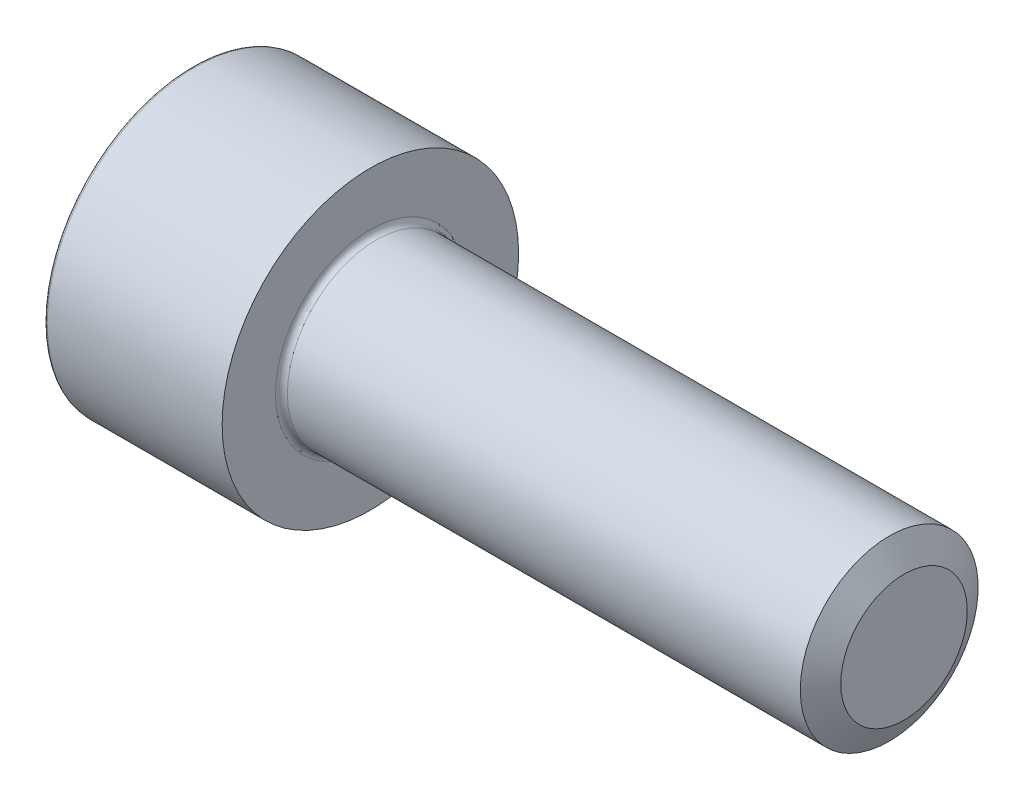
ISO-10303-21;
HEADER;
FILE_DESCRIPTION(('STEP AP214'),'2;1');
FILE_NAME('part.step','',(''),(''),'','','');
FILE_SCHEMA(('AUTOMOTIVE_DESIGN { 1 0 10303 214 1 1 1 1 }'));
ENDSEC;
DATA;
#1=APPLICATION_CONTEXT('core data for automotive mechanical design processes');
#2=APPLICATION_PROTOCOL_DEFINITION('international standard','automotive_design',2000,#1);
#3=PRODUCT_CONTEXT('',#1,'mechanical');
#4=PRODUCT('Part','Part','',(#3));
#5=PRODUCT_RELATED_PRODUCT_CATEGORY('part','',(#4));
#6=PRODUCT_DEFINITION_FORMATION('','',#4);
#7=PRODUCT_DEFINITION_CONTEXT('part definition',#1,'design');
#8=PRODUCT_DEFINITION('design','',#6,#7);
#9=PRODUCT_DEFINITION_SHAPE('','',#8);
#10=(LENGTH_UNIT() NAMED_UNIT(*) SI_UNIT(.MILLI.,.METRE.));
#11=(NAMED_UNIT(*) PLANE_ANGLE_UNIT() SI_UNIT($,.RADIAN.));
#12=(NAMED_UNIT(*) SI_UNIT($,.STERADIAN.) SOLID_ANGLE_UNIT());
#13=UNCERTAINTY_MEASURE_WITH_UNIT(LENGTH_MEASURE(1.E-05),#10,'distance_accuracy_value','');
#14=(GEOMETRIC_REPRESENTATION_CONTEXT(3) GLOBAL_UNCERTAINTY_ASSIGNED_CONTEXT((#13)) GLOBAL_UNIT_ASSIGNED_CONTEXT((#10,
#11,#12)) REPRESENTATION_CONTEXT('',''));
#15=CARTESIAN_POINT('',(0.,0.,0.));
#16=DIRECTION('',(0.,0.,1.));
#17=DIRECTION('',(1.,0.,0.));
#18=AXIS2_PLACEMENT_3D('',#15,#16,#17);
#19=CARTESIAN_POINT('',(0.,0.,0.));
#20=DIRECTION('',(-1.,0.,0.));
#21=DIRECTION('',(0.,0.,1.));
#22=AXIS2_PLACEMENT_3D('',#19,#20,#21);
#23=CYLINDRICAL_SURFACE('',#22,3.);
#24=CARTESIAN_POINT('',(6.2,0.,0.));
#25=DIRECTION('',(-1.,0.,0.));
#26=DIRECTION('',(0.,0.,1.));
#27=AXIS2_PLACEMENT_3D('',#24,#25,#26);
#28=CIRCLE('',#27,3.);
#29=CARTESIAN_POINT('',(6.2,0.,3.));
#30=VERTEX_POINT('',#29);
#31=EDGE_CURVE('E148',#30,#30,#28,.T.);
#32=ORIENTED_EDGE('',*,*,#31,.F.);
#33=EDGE_LOOP('',(#32));
#34=FACE_BOUND('',#33,.T.);
#35=CARTESIAN_POINT('',(23.5000146668818,0.,0.));
#36=DIRECTION('',(-1.,0.,0.));
#37=DIRECTION('',(0.,0.,1.));
#38=AXIS2_PLACEMENT_3D('',#35,#36,#37);
#39=CIRCLE('',#38,3.);
#40=CARTESIAN_POINT('',(23.5000146668818,0.,3.));
#41=VERTEX_POINT('',#40);
#42=EDGE_CURVE('E135',#41,#41,#39,.T.);
#43=ORIENTED_EDGE('',*,*,#42,.T.);
#44=EDGE_LOOP('',(#43));
#45=FACE_BOUND('',#44,.T.);
#46=ADVANCED_FACE('F45',(#34,#45),#23,.T.);
#47=CARTESIAN_POINT('',(0.,0.,0.));
#48=DIRECTION('',(1.,0.,0.));
#49=DIRECTION('',(0.,0.,-1.));
#50=AXIS2_PLACEMENT_3D('',#47,#48,#49);
#51=PLANE('',#50);
#52=CARTESIAN_POINT('',(0.,0.,0.));
#53=DIRECTION('',(1.,0.,0.));
#54=DIRECTION('',(0.,0.,-1.));
#55=AXIS2_PLACEMENT_3D('',#52,#53,#54);
#56=CIRCLE('',#55,4.9);
#57=CARTESIAN_POINT('',(0.,0.,-4.9));
#58=VERTEX_POINT('',#57);
#59=EDGE_CURVE('E53',#58,#58,#56,.F.);
#60=ORIENTED_EDGE('',*,*,#59,.T.);
#61=EDGE_LOOP('',(#60));
#62=FACE_BOUND('',#61,.T.);
#63=DIRECTION('',(0.,0.866025403784439,-0.5));
#64=VECTOR('',#63,1.);
#65=CARTESIAN_POINT('',(0.,0.,2.86));
#66=LINE('',#65,#64);
#67=CARTESIAN_POINT('',(0.,0.,2.86));
#68=VERTEX_POINT('',#67);
#69=CARTESIAN_POINT('',(0.,2.47683265482349,1.43));
#70=VERTEX_POINT('',#69);
#71=EDGE_CURVE('E134',#68,#70,#66,.T.);
#72=ORIENTED_EDGE('',*,*,#71,.F.);
#73=DIRECTION('',(0.,0.866025403784439,0.5));
#74=VECTOR('',#73,1.);
#75=CARTESIAN_POINT('',(0.,-2.47683265482349,1.43));
#76=LINE('',#75,#74);
#77=CARTESIAN_POINT('',(0.,-2.47683265482349,1.43));
#78=VERTEX_POINT('',#77);
#79=EDGE_CURVE('E60',#78,#68,#76,.T.);
#80=ORIENTED_EDGE('',*,*,#79,.F.);
#81=DIRECTION('',(0.,0.,1.));
#82=VECTOR('',#81,1.);
#83=CARTESIAN_POINT('',(0.,-2.47683265482349,-1.43));
#84=LINE('',#83,#82);
#85=CARTESIAN_POINT('',(0.,-2.47683265482349,-1.43));
#86=VERTEX_POINT('',#85);
#87=EDGE_CURVE('E144',#86,#78,#84,.T.);
#88=ORIENTED_EDGE('',*,*,#87,.F.);
#89=DIRECTION('',(0.,-0.866025403784439,0.5));
#90=VECTOR('',#89,1.);
#91=CARTESIAN_POINT('',(0.,0.,-2.86));
#92=LINE('',#91,#90);
#93=CARTESIAN_POINT('',(0.,0.,-2.86));
#94=VERTEX_POINT('',#93);
#95=EDGE_CURVE('E142',#94,#86,#92,.T.);
#96=ORIENTED_EDGE('',*,*,#95,.F.);
#97=DIRECTION('',(0.,-0.866025403784439,-0.5));
#98=VECTOR('',#97,1.);
#99=CARTESIAN_POINT('',(0.,2.47683265482349,-1.43));
#100=LINE('',#99,#98);
#101=CARTESIAN_POINT('',(0.,2.47683265482349,-1.43));
#102=VERTEX_POINT('',#101);
#103=EDGE_CURVE('E108',#102,#94,#100,.T.);
#104=ORIENTED_EDGE('',*,*,#103,.F.);
#105=DIRECTION('',(0.,0.,-1.));
#106=VECTOR('',#105,1.);
#107=CARTESIAN_POINT('',(0.,2.47683265482349,1.43));
#108=LINE('',#107,#106);
#109=EDGE_CURVE('E138',#70,#102,#108,.T.);
#110=ORIENTED_EDGE('',*,*,#109,.F.);
#111=EDGE_LOOP('',(#72,#80,#88,#96,#104,#110));
#112=FACE_BOUND('',#111,.T.);
#113=ADVANCED_FACE('F165',(#62,#112),#51,.F.);
#114=CARTESIAN_POINT('',(0.,0.,0.));
#115=DIRECTION('',(-1.,0.,0.));
#116=DIRECTION('',(0.,0.,1.));
#117=AXIS2_PLACEMENT_3D('',#114,#115,#116);
#118=CYLINDRICAL_SURFACE('',#117,5.);
#119=CARTESIAN_POINT('',(0.1,0.,0.));
#120=DIRECTION('',(1.,0.,0.));
#121=DIRECTION('',(0.,0.,-1.));
#122=AXIS2_PLACEMENT_3D('',#119,#120,#121);
#123=CIRCLE('',#122,5.);
#124=CARTESIAN_POINT('',(0.1,0.,-5.));
#125=VERTEX_POINT('',#124);
#126=EDGE_CURVE('E11',#125,#125,#123,.T.);
#127=ORIENTED_EDGE('',*,*,#126,.T.);
#128=EDGE_LOOP('',(#127));
#129=FACE_BOUND('',#128,.T.);
#130=CARTESIAN_POINT('',(6.,0.,0.));
#131=DIRECTION('',(-1.,0.,0.));
#132=DIRECTION('',(0.,0.,1.));
#133=AXIS2_PLACEMENT_3D('',#130,#131,#132);
#134=CIRCLE('',#133,5.);
#135=CARTESIAN_POINT('',(6.,0.,5.));
#136=VERTEX_POINT('',#135);
#137=EDGE_CURVE('E159',#136,#136,#134,.T.);
#138=ORIENTED_EDGE('',*,*,#137,.T.);
#139=EDGE_LOOP('',(#138));
#140=FACE_BOUND('',#139,.T.);
#141=ADVANCED_FACE('F186',(#129,#140),#118,.T.);
#142=CARTESIAN_POINT('',(6.,5.,0.));
#143=DIRECTION('',(-1.,0.,0.));
#144=DIRECTION('',(0.,0.,1.));
#145=AXIS2_PLACEMENT_3D('',#142,#143,#144);
#146=PLANE('',#145);
#147=ORIENTED_EDGE('',*,*,#137,.F.);
#148=EDGE_LOOP('',(#147));
#149=FACE_BOUND('',#148,.T.);
#150=CARTESIAN_POINT('',(6.,0.,0.));
#151=DIRECTION('',(-1.,0.,0.));
#152=DIRECTION('',(0.,0.,1.));
#153=AXIS2_PLACEMENT_3D('',#150,#151,#152);
#154=CIRCLE('',#153,3.2);
#155=CARTESIAN_POINT('',(6.,0.,3.2));
#156=VERTEX_POINT('',#155);
#157=EDGE_CURVE('E156',#156,#156,#154,.T.);
#158=ORIENTED_EDGE('',*,*,#157,.T.);
#159=EDGE_LOOP('',(#158));
#160=FACE_BOUND('',#159,.T.);
#161=ADVANCED_FACE('F195',(#149,#160),#146,.F.);
#162=CARTESIAN_POINT('',(6.2,0.,0.));
#163=DIRECTION('',(-1.,0.,0.));
#164=DIRECTION('',(0.,0.,1.));
#165=AXIS2_PLACEMENT_3D('',#162,#163,#164);
#166=TOROIDAL_SURFACE('',#165,3.2,0.2);
#167=ORIENTED_EDGE('',*,*,#157,.F.);
#168=EDGE_LOOP('',(#167));
#169=FACE_BOUND('',#168,.T.);
#170=ORIENTED_EDGE('',*,*,#31,.T.);
#171=EDGE_LOOP('',(#170));
#172=FACE_BOUND('',#171,.T.);
#173=ADVANCED_FACE('F191',(#169,#172),#166,.F.);
#174=CARTESIAN_POINT('',(3.,-2.47683265482349,1.43));
#175=DIRECTION('',(0.,-0.5,0.866025403784439));
#176=DIRECTION('',(0.,-0.866025403784439,-0.5));
#177=AXIS2_PLACEMENT_3D('',#174,#175,#176);
#178=PLANE('',#177);
#179=ORIENTED_EDGE('',*,*,#79,.T.);
#180=DIRECTION('',(-1.,0.,0.));
#181=VECTOR('',#180,1.);
#182=CARTESIAN_POINT('',(3.,0.,2.86));
#183=LINE('',#182,#181);
#184=CARTESIAN_POINT('',(3.,0.,2.86));
#185=VERTEX_POINT('',#184);
#186=EDGE_CURVE('E90',#185,#68,#183,.T.);
#187=ORIENTED_EDGE('',*,*,#186,.F.);
#188=DIRECTION('',(0.,0.866025403784439,0.5));
#189=VECTOR('',#188,1.);
#190=CARTESIAN_POINT('',(3.,-2.47683265482349,1.43));
#191=LINE('',#190,#189);
#192=CARTESIAN_POINT('',(3.,-2.47683265482349,1.43));
#193=VERTEX_POINT('',#192);
#194=EDGE_CURVE('E146',#193,#185,#191,.T.);
#195=ORIENTED_EDGE('',*,*,#194,.F.);
#196=DIRECTION('',(-1.,0.,0.));
#197=VECTOR('',#196,1.);
#198=CARTESIAN_POINT('',(3.,-2.47683265482349,1.43));
#199=LINE('',#198,#197);
#200=EDGE_CURVE('E68',#193,#78,#199,.T.);
#201=ORIENTED_EDGE('',*,*,#200,.T.);
#202=EDGE_LOOP('',(#179,#187,#195,#201));
#203=FACE_BOUND('',#202,.T.);
#204=ADVANCED_FACE('F194',(#203),#178,.F.);
#205=CARTESIAN_POINT('',(3.,-2.47683265482349,-1.43));
#206=DIRECTION('',(0.,-1.,0.));
#207=DIRECTION('',(0.,0.,-1.));
#208=AXIS2_PLACEMENT_3D('',#205,#206,#207);
#209=PLANE('',#208);
#210=ORIENTED_EDGE('',*,*,#87,.T.);
#211=ORIENTED_EDGE('',*,*,#200,.F.);
#212=DIRECTION('',(0.,0.,1.));
#213=VECTOR('',#212,1.);
#214=CARTESIAN_POINT('',(3.,-2.47683265482349,-1.43));
#215=LINE('',#214,#213);
#216=CARTESIAN_POINT('',(3.,-2.47683265482349,-1.43));
#217=VERTEX_POINT('',#216);
#218=EDGE_CURVE('E120',#217,#193,#215,.T.);
#219=ORIENTED_EDGE('',*,*,#218,.F.);
#220=DIRECTION('',(-1.,0.,0.));
#221=VECTOR('',#220,1.);
#222=CARTESIAN_POINT('',(3.,-2.47683265482349,-1.43));
#223=LINE('',#222,#221);
#224=EDGE_CURVE('E112',#217,#86,#223,.T.);
#225=ORIENTED_EDGE('',*,*,#224,.T.);
#226=EDGE_LOOP('',(#210,#211,#219,#225));
#227=FACE_BOUND('',#226,.T.);
#228=ADVANCED_FACE('F265',(#227),#209,.F.);
#229=CARTESIAN_POINT('',(3.,0.,-2.86));
#230=DIRECTION('',(0.,-0.5,-0.866025403784438));
#231=DIRECTION('',(0.,0.866025403784439,-0.5));
#232=AXIS2_PLACEMENT_3D('',#229,#230,#231);
#233=PLANE('',#232);
#234=ORIENTED_EDGE('',*,*,#95,.T.);
#235=ORIENTED_EDGE('',*,*,#224,.F.);
#236=DIRECTION('',(0.,-0.866025403784439,0.5));
#237=VECTOR('',#236,1.);
#238=CARTESIAN_POINT('',(3.,0.,-2.86));
#239=LINE('',#238,#237);
#240=CARTESIAN_POINT('',(3.,0.,-2.86));
#241=VERTEX_POINT('',#240);
#242=EDGE_CURVE('E116',#241,#217,#239,.T.);
#243=ORIENTED_EDGE('',*,*,#242,.F.);
#244=DIRECTION('',(-1.,0.,0.));
#245=VECTOR('',#244,1.);
#246=CARTESIAN_POINT('',(3.,0.,-2.86));
#247=LINE('',#246,#245);
#248=EDGE_CURVE('E101',#241,#94,#247,.T.);
#249=ORIENTED_EDGE('',*,*,#248,.T.);
#250=EDGE_LOOP('',(#234,#235,#243,#249));
#251=FACE_BOUND('',#250,.T.);
#252=ADVANCED_FACE('F117',(#251),#233,.F.);
#253=CARTESIAN_POINT('',(3.,2.47683265482349,-1.43));
#254=DIRECTION('',(0.,0.5,-0.866025403784439));
#255=DIRECTION('',(0.,0.866025403784439,0.5));
#256=AXIS2_PLACEMENT_3D('',#253,#254,#255);
#257=PLANE('',#256);
#258=ORIENTED_EDGE('',*,*,#103,.T.);
#259=ORIENTED_EDGE('',*,*,#248,.F.);
#260=DIRECTION('',(0.,-0.866025403784439,-0.5));
#261=VECTOR('',#260,1.);
#262=CARTESIAN_POINT('',(3.,2.47683265482349,-1.43));
#263=LINE('',#262,#261);
#264=CARTESIAN_POINT('',(3.,2.47683265482349,-1.43));
#265=VERTEX_POINT('',#264);
#266=EDGE_CURVE('E105',#265,#241,#263,.T.);
#267=ORIENTED_EDGE('',*,*,#266,.F.);
#268=DIRECTION('',(-1.,0.,0.));
#269=VECTOR('',#268,1.);
#270=CARTESIAN_POINT('',(3.,2.47683265482349,-1.43));
#271=LINE('',#270,#269);
#272=EDGE_CURVE('E113',#265,#102,#271,.T.);
#273=ORIENTED_EDGE('',*,*,#272,.T.);
#274=EDGE_LOOP('',(#258,#259,#267,#273));
#275=FACE_BOUND('',#274,.T.);
#276=ADVANCED_FACE('F103',(#275),#257,.F.);
#277=CARTESIAN_POINT('',(3.,2.47683265482349,1.43));
#278=DIRECTION('',(0.,1.,0.));
#279=DIRECTION('',(0.,0.,1.));
#280=AXIS2_PLACEMENT_3D('',#277,#278,#279);
#281=PLANE('',#280);
#282=ORIENTED_EDGE('',*,*,#109,.T.);
#283=ORIENTED_EDGE('',*,*,#272,.F.);
#284=DIRECTION('',(0.,0.,-1.));
#285=VECTOR('',#284,1.);
#286=CARTESIAN_POINT('',(3.,2.47683265482349,1.43));
#287=LINE('',#286,#285);
#288=CARTESIAN_POINT('',(3.,2.47683265482349,1.43));
#289=VERTEX_POINT('',#288);
#290=EDGE_CURVE('E126',#289,#265,#287,.T.);
#291=ORIENTED_EDGE('',*,*,#290,.F.);
#292=DIRECTION('',(-1.,0.,0.));
#293=VECTOR('',#292,1.);
#294=CARTESIAN_POINT('',(3.,2.47683265482349,1.43));
#295=LINE('',#294,#293);
#296=EDGE_CURVE('E151',#289,#70,#295,.T.);
#297=ORIENTED_EDGE('',*,*,#296,.T.);
#298=EDGE_LOOP('',(#282,#283,#291,#297));
#299=FACE_BOUND('',#298,.T.);
#300=ADVANCED_FACE('F244',(#299),#281,.F.);
#301=CARTESIAN_POINT('',(3.,0.,2.86));
#302=DIRECTION('',(0.,0.5,0.866025403784438));
#303=DIRECTION('',(0.,-0.866025403784439,0.5));
#304=AXIS2_PLACEMENT_3D('',#301,#302,#303);
#305=PLANE('',#304);
#306=ORIENTED_EDGE('',*,*,#71,.T.);
#307=ORIENTED_EDGE('',*,*,#296,.F.);
#308=DIRECTION('',(0.,0.866025403784439,-0.5));
#309=VECTOR('',#308,1.);
#310=CARTESIAN_POINT('',(3.,0.,2.86));
#311=LINE('',#310,#309);
#312=EDGE_CURVE('E128',#185,#289,#311,.T.);
#313=ORIENTED_EDGE('',*,*,#312,.F.);
#314=ORIENTED_EDGE('',*,*,#186,.T.);
#315=EDGE_LOOP('',(#306,#307,#313,#314));
#316=FACE_BOUND('',#315,.T.);
#317=ADVANCED_FACE('F237',(#316),#305,.F.);
#318=CARTESIAN_POINT('',(3.,-2.47683265482349,1.43));
#319=DIRECTION('',(1.,0.,0.));
#320=DIRECTION('',(0.,0.,-1.));
#321=AXIS2_PLACEMENT_3D('',#318,#319,#320);
#322=PLANE('',#321);
#323=ORIENTED_EDGE('',*,*,#194,.T.);
#324=ORIENTED_EDGE('',*,*,#312,.T.);
#325=ORIENTED_EDGE('',*,*,#290,.T.);
#326=ORIENTED_EDGE('',*,*,#266,.T.);
#327=ORIENTED_EDGE('',*,*,#242,.T.);
#328=ORIENTED_EDGE('',*,*,#218,.T.);
#329=EDGE_LOOP('',(#323,#324,#325,#326,#327,#328));
#330=FACE_BOUND('',#329,.T.);
#331=ADVANCED_FACE('F123',(#330),#322,.F.);
#332=CARTESIAN_POINT('',(23.5000146668818,0.,0.));
#333=DIRECTION('',(-1.,0.,0.));
#334=DIRECTION('',(0.,0.,1.));
#335=AXIS2_PLACEMENT_3D('',#332,#333,#334);
#336=CONICAL_SURFACE('',#335,3.,1.0471975511966);
#337=CARTESIAN_POINT('',(24.,0.,0.));
#338=DIRECTION('',(-1.,0.,0.));
#339=DIRECTION('',(0.,0.,1.));
#340=AXIS2_PLACEMENT_3D('',#337,#338,#339);
#341=CIRCLE('',#340,2.134);
#342=CARTESIAN_POINT('',(24.,0.,2.134));
#343=VERTEX_POINT('',#342);
#344=EDGE_CURVE('E295',#343,#343,#341,.T.);
#345=ORIENTED_EDGE('',*,*,#344,.T.);
#346=EDGE_LOOP('',(#345));
#347=FACE_BOUND('',#346,.T.);
#348=ORIENTED_EDGE('',*,*,#42,.F.);
#349=EDGE_LOOP('',(#348));
#350=FACE_BOUND('',#349,.T.);
#351=ADVANCED_FACE('F175',(#347,#350),#336,.T.);
#352=CARTESIAN_POINT('',(24.,3.,0.));
#353=DIRECTION('',(-1.,0.,0.));
#354=DIRECTION('',(0.,0.,1.));
#355=AXIS2_PLACEMENT_3D('',#352,#353,#354);
#356=PLANE('',#355);
#357=ORIENTED_EDGE('',*,*,#344,.F.);
#358=EDGE_LOOP('',(#357));
#359=FACE_BOUND('',#358,.T.);
#360=ADVANCED_FACE('F169',(#359),#356,.F.);
#361=CARTESIAN_POINT('',(0.1,0.,0.));
#362=DIRECTION('',(1.,0.,0.));
#363=DIRECTION('',(0.,0.,-1.));
#364=AXIS2_PLACEMENT_3D('',#361,#362,#363);
#365=TOROIDAL_SURFACE('',#364,4.9,0.1);
#366=ORIENTED_EDGE('',*,*,#126,.F.);
#367=EDGE_LOOP('',(#366));
#368=FACE_BOUND('',#367,.T.);
#369=ORIENTED_EDGE('',*,*,#59,.F.);
#370=EDGE_LOOP('',(#369));
#371=FACE_BOUND('',#370,.T.);
#372=ADVANCED_FACE('F47',(#368,#371),#365,.T.);
#373=CLOSED_SHELL('',(#46,#113,#141,#161,#173,#204,#228,#252,#276,#300,#317,#331,#351,#360,#372));
#374=MANIFOLD_SOLID_BREP('B2',#373);
#375=ADVANCED_BREP_SHAPE_REPRESENTATION('',(#18,#374),#14);
#376=SHAPE_DEFINITION_REPRESENTATION(#9,#375);
ENDSEC;
END-ISO-10303-21;
